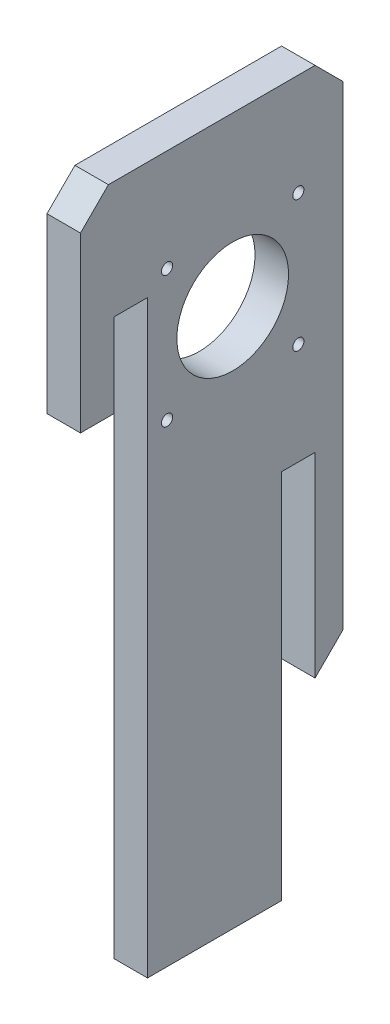
ISO-10303-21;
HEADER;
FILE_DESCRIPTION(('STEP AP214'),'2;1');
FILE_NAME('part.step','',(''),(''),'','','');
FILE_SCHEMA(('AUTOMOTIVE_DESIGN { 1 0 10303 214 1 1 1 1 }'));
ENDSEC;
DATA;
#1=APPLICATION_CONTEXT('core data for automotive mechanical design processes');
#2=APPLICATION_PROTOCOL_DEFINITION('international standard','automotive_design',2000,#1);
#3=PRODUCT_CONTEXT('',#1,'mechanical');
#4=PRODUCT('Part','Part','',(#3));
#5=PRODUCT_RELATED_PRODUCT_CATEGORY('part','',(#4));
#6=PRODUCT_DEFINITION_FORMATION('','',#4);
#7=PRODUCT_DEFINITION_CONTEXT('part definition',#1,'design');
#8=PRODUCT_DEFINITION('design','',#6,#7);
#9=PRODUCT_DEFINITION_SHAPE('','',#8);
#10=(LENGTH_UNIT() NAMED_UNIT(*) SI_UNIT(.MILLI.,.METRE.));
#11=(NAMED_UNIT(*) PLANE_ANGLE_UNIT() SI_UNIT($,.RADIAN.));
#12=(NAMED_UNIT(*) SI_UNIT($,.STERADIAN.) SOLID_ANGLE_UNIT());
#13=UNCERTAINTY_MEASURE_WITH_UNIT(LENGTH_MEASURE(1.E-05),#10,'distance_accuracy_value','');
#14=(GEOMETRIC_REPRESENTATION_CONTEXT(3) GLOBAL_UNCERTAINTY_ASSIGNED_CONTEXT((#13)) GLOBAL_UNIT_ASSIGNED_CONTEXT((#10,
#11,#12)) REPRESENTATION_CONTEXT('',''));
#15=CARTESIAN_POINT('',(0.,0.,0.));
#16=DIRECTION('',(0.,0.,1.));
#17=DIRECTION('',(1.,0.,0.));
#18=AXIS2_PLACEMENT_3D('',#15,#16,#17);
#19=CARTESIAN_POINT('',(0.,-60.,-29.5));
#20=DIRECTION('',(1.,0.,0.));
#21=DIRECTION('',(0.,0.,-1.));
#22=AXIS2_PLACEMENT_3D('',#19,#20,#21);
#23=PLANE('',#22);
#24=CARTESIAN_POINT('',(0.,45.,0.));
#25=DIRECTION('',(-1.,0.,0.));
#26=DIRECTION('',(0.,0.,1.));
#27=AXIS2_PLACEMENT_3D('',#24,#25,#26);
#28=CIRCLE('',#27,6.);
#29=CARTESIAN_POINT('',(0.,45.,6.));
#30=VERTEX_POINT('',#29);
#31=EDGE_CURVE('E255',#30,#30,#28,.T.);
#32=ORIENTED_EDGE('',*,*,#31,.F.);
#33=EDGE_LOOP('',(#32));
#34=FACE_BOUND('',#33,.T.);
#35=CARTESIAN_POINT('',(0.,-45.,0.));
#36=DIRECTION('',(-1.,0.,0.));
#37=DIRECTION('',(0.,0.,1.));
#38=AXIS2_PLACEMENT_3D('',#35,#36,#37);
#39=CIRCLE('',#38,6.);
#40=CARTESIAN_POINT('',(0.,-45.,6.));
#41=VERTEX_POINT('',#40);
#42=EDGE_CURVE('E249',#41,#41,#39,.T.);
#43=ORIENTED_EDGE('',*,*,#42,.F.);
#44=EDGE_LOOP('',(#43));
#45=FACE_BOUND('',#44,.T.);
#46=CARTESIAN_POINT('',(0.,23.5,-23.5));
#47=DIRECTION('',(-1.,0.,0.));
#48=DIRECTION('',(0.,0.,1.));
#49=AXIS2_PLACEMENT_3D('',#46,#47,#48);
#50=CIRCLE('',#49,1.99999999999999);
#51=CARTESIAN_POINT('',(0.,23.5,-21.5));
#52=VERTEX_POINT('',#51);
#53=EDGE_CURVE('E243',#52,#52,#50,.T.);
#54=ORIENTED_EDGE('',*,*,#53,.F.);
#55=EDGE_LOOP('',(#54));
#56=FACE_BOUND('',#55,.T.);
#57=CARTESIAN_POINT('',(0.,23.5,23.5));
#58=DIRECTION('',(-1.,0.,0.));
#59=DIRECTION('',(0.,0.,1.));
#60=AXIS2_PLACEMENT_3D('',#57,#58,#59);
#61=CIRCLE('',#60,1.99999999999999);
#62=CARTESIAN_POINT('',(0.,23.5,25.5));
#63=VERTEX_POINT('',#62);
#64=EDGE_CURVE('E237',#63,#63,#61,.T.);
#65=ORIENTED_EDGE('',*,*,#64,.F.);
#66=EDGE_LOOP('',(#65));
#67=FACE_BOUND('',#66,.T.);
#68=CARTESIAN_POINT('',(0.,-23.5,23.5));
#69=DIRECTION('',(-1.,0.,0.));
#70=DIRECTION('',(0.,0.,1.));
#71=AXIS2_PLACEMENT_3D('',#68,#69,#70);
#72=CIRCLE('',#71,1.99999999999999);
#73=CARTESIAN_POINT('',(0.,-23.5,25.5));
#74=VERTEX_POINT('',#73);
#75=EDGE_CURVE('E231',#74,#74,#72,.T.);
#76=ORIENTED_EDGE('',*,*,#75,.F.);
#77=EDGE_LOOP('',(#76));
#78=FACE_BOUND('',#77,.T.);
#79=CARTESIAN_POINT('',(0.,0.,0.));
#80=DIRECTION('',(1.,0.,0.));
#81=DIRECTION('',(0.,0.,-1.));
#82=AXIS2_PLACEMENT_3D('',#79,#80,#81);
#83=CIRCLE('',#82,20.);
#84=CARTESIAN_POINT('',(0.,0.,-20.));
#85=VERTEX_POINT('',#84);
#86=EDGE_CURVE('E216',#85,#85,#83,.T.);
#87=ORIENTED_EDGE('',*,*,#86,.T.);
#88=EDGE_LOOP('',(#87));
#89=FACE_BOUND('',#88,.T.);
#90=DIRECTION('',(0.,1.,0.));
#91=VECTOR('',#90,1.);
#92=CARTESIAN_POINT('',(0.,60.,-39.5));
#93=LINE('',#92,#91);
#94=CARTESIAN_POINT('',(0.,-120.,-39.5));
#95=VERTEX_POINT('',#94);
#96=CARTESIAN_POINT('',(0.,50.,-39.5));
#97=VERTEX_POINT('',#96);
#98=EDGE_CURVE('E139',#95,#97,#93,.T.);
#99=ORIENTED_EDGE('',*,*,#98,.F.);
#100=DIRECTION('',(0.,0.707106781186549,-0.707106781186546));
#101=VECTOR('',#100,1.);
#102=CARTESIAN_POINT('',(0.,-130.,-29.5000000000001));
#103=LINE('',#102,#101);
#104=CARTESIAN_POINT('',(0.,-130.,-29.5));
#105=VERTEX_POINT('',#104);
#106=EDGE_CURVE('E11',#95,#105,#103,.F.);
#107=ORIENTED_EDGE('',*,*,#106,.T.);
#108=DIRECTION('',(0.,-1.,0.));
#109=VECTOR('',#108,1.);
#110=CARTESIAN_POINT('',(0.,60.,-29.5));
#111=LINE('',#110,#109);
#112=CARTESIAN_POINT('',(0.,-60.,-29.5));
#113=VERTEX_POINT('',#112);
#114=EDGE_CURVE('E137',#113,#105,#111,.T.);
#115=ORIENTED_EDGE('',*,*,#114,.F.);
#116=DIRECTION('',(0.,0.,-1.));
#117=VECTOR('',#116,1.);
#118=CARTESIAN_POINT('',(0.,-60.,29.5));
#119=LINE('',#118,#117);
#120=CARTESIAN_POINT('',(0.,-60.,-17.5));
#121=VERTEX_POINT('',#120);
#122=EDGE_CURVE('E202',#121,#113,#119,.T.);
#123=ORIENTED_EDGE('',*,*,#122,.F.);
#124=DIRECTION('',(0.,-1.,0.));
#125=VECTOR('',#124,1.);
#126=CARTESIAN_POINT('',(0.,-60.,-17.5));
#127=LINE('',#126,#125);
#128=CARTESIAN_POINT('',(0.,-193.,-17.5));
#129=VERTEX_POINT('',#128);
#130=EDGE_CURVE('E152',#121,#129,#127,.T.);
#131=ORIENTED_EDGE('',*,*,#130,.T.);
#132=DIRECTION('',(0.,0.,1.));
#133=VECTOR('',#132,1.);
#134=CARTESIAN_POINT('',(0.,-193.,30.5));
#135=LINE('',#134,#133);
#136=CARTESIAN_POINT('',(0.,-193.,30.5));
#137=VERTEX_POINT('',#136);
#138=EDGE_CURVE('E155',#129,#137,#135,.T.);
#139=ORIENTED_EDGE('',*,*,#138,.T.);
#140=DIRECTION('',(0.,1.,0.));
#141=VECTOR('',#140,1.);
#142=CARTESIAN_POINT('',(0.,-60.,30.5));
#143=LINE('',#142,#141);
#144=CARTESIAN_POINT('',(0.,18.,30.5));
#145=VERTEX_POINT('',#144);
#146=EDGE_CURVE('E176',#137,#145,#143,.T.);
#147=ORIENTED_EDGE('',*,*,#146,.T.);
#148=DIRECTION('',(0.,0.,1.));
#149=VECTOR('',#148,1.);
#150=CARTESIAN_POINT('',(0.,18.,30.5));
#151=LINE('',#150,#149);
#152=CARTESIAN_POINT('',(0.,18.,42.5));
#153=VERTEX_POINT('',#152);
#154=EDGE_CURVE('E276',#145,#153,#151,.T.);
#155=ORIENTED_EDGE('',*,*,#154,.T.);
#156=DIRECTION('',(0.,-1.,0.));
#157=VECTOR('',#156,1.);
#158=CARTESIAN_POINT('',(0.,18.,42.5));
#159=LINE('',#158,#157);
#160=CARTESIAN_POINT('',(0.,-12.,42.5));
#161=VERTEX_POINT('',#160);
#162=EDGE_CURVE('E273',#153,#161,#159,.T.);
#163=ORIENTED_EDGE('',*,*,#162,.T.);
#164=DIRECTION('',(0.,0.,1.));
#165=VECTOR('',#164,1.);
#166=CARTESIAN_POINT('',(0.,-12.,42.5));
#167=LINE('',#166,#165);
#168=CARTESIAN_POINT('',(0.,-12.,54.5));
#169=VERTEX_POINT('',#168);
#170=EDGE_CURVE('E270',#161,#169,#167,.T.);
#171=ORIENTED_EDGE('',*,*,#170,.T.);
#172=DIRECTION('',(0.,1.,0.));
#173=VECTOR('',#172,1.);
#174=CARTESIAN_POINT('',(0.,-12.,54.5));
#175=LINE('',#174,#173);
#176=CARTESIAN_POINT('',(0.,50.,54.5));
#177=VERTEX_POINT('',#176);
#178=EDGE_CURVE('E267',#169,#177,#175,.T.);
#179=ORIENTED_EDGE('',*,*,#178,.T.);
#180=DIRECTION('',(0.,0.707106781186547,-0.707106781186549));
#181=VECTOR('',#180,1.);
#182=CARTESIAN_POINT('',(0.,50.,54.5));
#183=LINE('',#182,#181);
#184=CARTESIAN_POINT('',(0.,60.,44.4999999999999));
#185=VERTEX_POINT('',#184);
#186=EDGE_CURVE('E409',#177,#185,#183,.T.);
#187=ORIENTED_EDGE('',*,*,#186,.T.);
#188=DIRECTION('',(0.,0.,1.));
#189=VECTOR('',#188,1.);
#190=CARTESIAN_POINT('',(0.,60.,29.5));
#191=LINE('',#190,#189);
#192=CARTESIAN_POINT('',(0.,60.,-29.4999999999999));
#193=VERTEX_POINT('',#192);
#194=EDGE_CURVE('E205',#193,#185,#191,.T.);
#195=ORIENTED_EDGE('',*,*,#194,.F.);
#196=DIRECTION('',(0.,-0.707106781186546,-0.707106781186549));
#197=VECTOR('',#196,1.);
#198=CARTESIAN_POINT('',(0.,50.,-39.5));
#199=LINE('',#198,#197);
#200=EDGE_CURVE('E407',#193,#97,#199,.T.);
#201=ORIENTED_EDGE('',*,*,#200,.T.);
#202=EDGE_LOOP('',(#99,#107,#115,#123,#131,#139,#147,#155,#163,#171,#179,#187,#195,#201));
#203=FACE_BOUND('',#202,.T.);
#204=CARTESIAN_POINT('',(0.,-23.5,-23.5));
#205=DIRECTION('',(-1.,0.,0.));
#206=DIRECTION('',(0.,0.,1.));
#207=AXIS2_PLACEMENT_3D('',#204,#205,#206);
#208=CIRCLE('',#207,1.99999999999999);
#209=CARTESIAN_POINT('',(0.,-23.5,-21.5));
#210=VERTEX_POINT('',#209);
#211=EDGE_CURVE('E225',#210,#210,#208,.T.);
#212=ORIENTED_EDGE('',*,*,#211,.F.);
#213=EDGE_LOOP('',(#212));
#214=FACE_BOUND('',#213,.T.);
#215=ADVANCED_FACE('F35',(#34,#45,#56,#67,#78,#89,#203,#214),#23,.F.);
#216=CARTESIAN_POINT('',(12.,-60.,-29.5));
#217=DIRECTION('',(1.,0.,0.));
#218=DIRECTION('',(0.,0.,-1.));
#219=AXIS2_PLACEMENT_3D('',#216,#217,#218);
#220=PLANE('',#219);
#221=CARTESIAN_POINT('',(12.,23.5,-23.5));
#222=DIRECTION('',(1.,0.,0.));
#223=DIRECTION('',(0.,0.,-1.));
#224=AXIS2_PLACEMENT_3D('',#221,#222,#223);
#225=CIRCLE('',#224,1.99999999999999);
#226=CARTESIAN_POINT('',(12.,23.5,-25.5));
#227=VERTEX_POINT('',#226);
#228=EDGE_CURVE('E240',#227,#227,#225,.T.);
#229=ORIENTED_EDGE('',*,*,#228,.F.);
#230=EDGE_LOOP('',(#229));
#231=FACE_BOUND('',#230,.T.);
#232=CARTESIAN_POINT('',(12.,23.5,23.5));
#233=DIRECTION('',(1.,0.,0.));
#234=DIRECTION('',(0.,0.,-1.));
#235=AXIS2_PLACEMENT_3D('',#232,#233,#234);
#236=CIRCLE('',#235,1.99999999999999);
#237=CARTESIAN_POINT('',(12.,23.5,21.5));
#238=VERTEX_POINT('',#237);
#239=EDGE_CURVE('E234',#238,#238,#236,.T.);
#240=ORIENTED_EDGE('',*,*,#239,.F.);
#241=EDGE_LOOP('',(#240));
#242=FACE_BOUND('',#241,.T.);
#243=CARTESIAN_POINT('',(12.,-23.5,23.5));
#244=DIRECTION('',(1.,0.,0.));
#245=DIRECTION('',(0.,0.,-1.));
#246=AXIS2_PLACEMENT_3D('',#243,#244,#245);
#247=CIRCLE('',#246,1.99999999999999);
#248=CARTESIAN_POINT('',(12.,-23.5,21.5));
#249=VERTEX_POINT('',#248);
#250=EDGE_CURVE('E228',#249,#249,#247,.T.);
#251=ORIENTED_EDGE('',*,*,#250,.F.);
#252=EDGE_LOOP('',(#251));
#253=FACE_BOUND('',#252,.T.);
#254=CARTESIAN_POINT('',(12.,-23.5,-23.5));
#255=DIRECTION('',(1.,0.,0.));
#256=DIRECTION('',(0.,0.,-1.));
#257=AXIS2_PLACEMENT_3D('',#254,#255,#256);
#258=CIRCLE('',#257,1.99999999999999);
#259=CARTESIAN_POINT('',(12.,-23.5,-25.5));
#260=VERTEX_POINT('',#259);
#261=EDGE_CURVE('E221',#260,#260,#258,.T.);
#262=ORIENTED_EDGE('',*,*,#261,.F.);
#263=EDGE_LOOP('',(#262));
#264=FACE_BOUND('',#263,.T.);
#265=DIRECTION('',(0.,-1.,0.));
#266=VECTOR('',#265,1.);
#267=CARTESIAN_POINT('',(12.,60.,-29.5));
#268=LINE('',#267,#266);
#269=CARTESIAN_POINT('',(12.,-60.,-29.5));
#270=VERTEX_POINT('',#269);
#271=CARTESIAN_POINT('',(12.,-130.,-29.5));
#272=VERTEX_POINT('',#271);
#273=EDGE_CURVE('E161',#270,#272,#268,.T.);
#274=ORIENTED_EDGE('',*,*,#273,.T.);
#275=DIRECTION('',(0.,-0.707106781186549,0.707106781186546));
#276=VECTOR('',#275,1.);
#277=CARTESIAN_POINT('',(12.,-94.9999999999998,-64.5));
#278=LINE('',#277,#276);
#279=CARTESIAN_POINT('',(12.,-120.,-39.5));
#280=VERTEX_POINT('',#279);
#281=EDGE_CURVE('E57',#272,#280,#278,.F.);
#282=ORIENTED_EDGE('',*,*,#281,.T.);
#283=DIRECTION('',(0.,1.,0.));
#284=VECTOR('',#283,1.);
#285=CARTESIAN_POINT('',(12.,60.,-39.5));
#286=LINE('',#285,#284);
#287=CARTESIAN_POINT('',(12.,50.,-39.5));
#288=VERTEX_POINT('',#287);
#289=EDGE_CURVE('E150',#280,#288,#286,.T.);
#290=ORIENTED_EDGE('',*,*,#289,.T.);
#291=DIRECTION('',(0.,0.707106781186546,0.707106781186549));
#292=VECTOR('',#291,1.);
#293=CARTESIAN_POINT('',(12.,1.52655665885959E-13,-89.5));
#294=LINE('',#293,#292);
#295=CARTESIAN_POINT('',(12.,60.,-29.5));
#296=VERTEX_POINT('',#295);
#297=EDGE_CURVE('E415',#288,#296,#294,.T.);
#298=ORIENTED_EDGE('',*,*,#297,.T.);
#299=DIRECTION('',(0.,0.,1.));
#300=VECTOR('',#299,1.);
#301=CARTESIAN_POINT('',(12.,60.,29.5));
#302=LINE('',#301,#300);
#303=CARTESIAN_POINT('',(12.,60.,44.4999999999999));
#304=VERTEX_POINT('',#303);
#305=EDGE_CURVE('E204',#296,#304,#302,.T.);
#306=ORIENTED_EDGE('',*,*,#305,.T.);
#307=DIRECTION('',(0.,-0.707106781186547,0.707106781186549));
#308=VECTOR('',#307,1.);
#309=CARTESIAN_POINT('',(12.,37.0000000000001,67.4999999999999));
#310=LINE('',#309,#308);
#311=CARTESIAN_POINT('',(12.,49.9999999999999,54.5));
#312=VERTEX_POINT('',#311);
#313=EDGE_CURVE('E416',#304,#312,#310,.T.);
#314=ORIENTED_EDGE('',*,*,#313,.T.);
#315=DIRECTION('',(0.,1.,0.));
#316=VECTOR('',#315,1.);
#317=CARTESIAN_POINT('',(12.,-12.,54.5));
#318=LINE('',#317,#316);
#319=CARTESIAN_POINT('',(12.,-12.,54.5));
#320=VERTEX_POINT('',#319);
#321=EDGE_CURVE('E262',#320,#312,#318,.T.);
#322=ORIENTED_EDGE('',*,*,#321,.F.);
#323=DIRECTION('',(0.,0.,1.));
#324=VECTOR('',#323,1.);
#325=CARTESIAN_POINT('',(12.,-12.,42.5));
#326=LINE('',#325,#324);
#327=CARTESIAN_POINT('',(12.,-12.,42.5));
#328=VERTEX_POINT('',#327);
#329=EDGE_CURVE('E283',#328,#320,#326,.T.);
#330=ORIENTED_EDGE('',*,*,#329,.F.);
#331=DIRECTION('',(0.,-1.,0.));
#332=VECTOR('',#331,1.);
#333=CARTESIAN_POINT('',(12.,18.,42.5));
#334=LINE('',#333,#332);
#335=CARTESIAN_POINT('',(12.,18.,42.5));
#336=VERTEX_POINT('',#335);
#337=EDGE_CURVE('E286',#336,#328,#334,.T.);
#338=ORIENTED_EDGE('',*,*,#337,.F.);
#339=DIRECTION('',(0.,0.,1.));
#340=VECTOR('',#339,1.);
#341=CARTESIAN_POINT('',(12.,18.,30.5));
#342=LINE('',#341,#340);
#343=CARTESIAN_POINT('',(12.,18.,30.5));
#344=VERTEX_POINT('',#343);
#345=EDGE_CURVE('E288',#344,#336,#342,.T.);
#346=ORIENTED_EDGE('',*,*,#345,.F.);
#347=DIRECTION('',(0.,1.,0.));
#348=VECTOR('',#347,1.);
#349=CARTESIAN_POINT('',(12.,-60.,30.5));
#350=LINE('',#349,#348);
#351=CARTESIAN_POINT('',(12.,-193.,30.5));
#352=VERTEX_POINT('',#351);
#353=EDGE_CURVE('E181',#352,#344,#350,.T.);
#354=ORIENTED_EDGE('',*,*,#353,.F.);
#355=DIRECTION('',(0.,0.,1.));
#356=VECTOR('',#355,1.);
#357=CARTESIAN_POINT('',(12.,-193.,30.5));
#358=LINE('',#357,#356);
#359=CARTESIAN_POINT('',(12.,-193.,-17.5));
#360=VERTEX_POINT('',#359);
#361=EDGE_CURVE('E166',#360,#352,#358,.T.);
#362=ORIENTED_EDGE('',*,*,#361,.F.);
#363=DIRECTION('',(0.,-1.,0.));
#364=VECTOR('',#363,1.);
#365=CARTESIAN_POINT('',(12.,-60.,-17.5));
#366=LINE('',#365,#364);
#367=CARTESIAN_POINT('',(12.,-60.,-17.5));
#368=VERTEX_POINT('',#367);
#369=EDGE_CURVE('E170',#368,#360,#366,.T.);
#370=ORIENTED_EDGE('',*,*,#369,.F.);
#371=DIRECTION('',(0.,0.,-1.));
#372=VECTOR('',#371,1.);
#373=CARTESIAN_POINT('',(12.,-60.,29.5));
#374=LINE('',#373,#372);
#375=EDGE_CURVE('E195',#368,#270,#374,.T.);
#376=ORIENTED_EDGE('',*,*,#375,.T.);
#377=EDGE_LOOP('',(#274,#282,#290,#298,#306,#314,#322,#330,#338,#346,#354,#362,#370,#376));
#378=FACE_BOUND('',#377,.T.);
#379=CARTESIAN_POINT('',(12.,0.,0.));
#380=DIRECTION('',(1.,0.,0.));
#381=DIRECTION('',(0.,0.,-1.));
#382=AXIS2_PLACEMENT_3D('',#379,#380,#381);
#383=CIRCLE('',#382,20.);
#384=CARTESIAN_POINT('',(12.,0.,-20.));
#385=VERTEX_POINT('',#384);
#386=EDGE_CURVE('E211',#385,#385,#383,.T.);
#387=ORIENTED_EDGE('',*,*,#386,.F.);
#388=EDGE_LOOP('',(#387));
#389=FACE_BOUND('',#388,.T.);
#390=ADVANCED_FACE('F298',(#231,#242,#253,#264,#378,#389),#220,.T.);
#391=CARTESIAN_POINT('',(12.,60.,29.5));
#392=DIRECTION('',(0.,-1.,0.));
#393=DIRECTION('',(0.,0.,-1.));
#394=AXIS2_PLACEMENT_3D('',#391,#392,#393);
#395=PLANE('',#394);
#396=ORIENTED_EDGE('',*,*,#305,.F.);
#397=DIRECTION('',(-1.,0.,0.));
#398=VECTOR('',#397,1.);
#399=CARTESIAN_POINT('',(0.,60.,-29.5));
#400=LINE('',#399,#398);
#401=EDGE_CURVE('E411',#296,#193,#400,.T.);
#402=ORIENTED_EDGE('',*,*,#401,.T.);
#403=ORIENTED_EDGE('',*,*,#194,.T.);
#404=DIRECTION('',(1.,0.,0.));
#405=VECTOR('',#404,1.);
#406=CARTESIAN_POINT('',(12.,60.,44.4999999999999));
#407=LINE('',#406,#405);
#408=EDGE_CURVE('E413',#185,#304,#407,.T.);
#409=ORIENTED_EDGE('',*,*,#408,.T.);
#410=EDGE_LOOP('',(#396,#402,#403,#409));
#411=FACE_BOUND('',#410,.T.);
#412=ADVANCED_FACE('F319',(#411),#395,.F.);
#413=CARTESIAN_POINT('',(12.,-60.,29.5));
#414=DIRECTION('',(0.,1.,0.));
#415=DIRECTION('',(0.,0.,1.));
#416=AXIS2_PLACEMENT_3D('',#413,#414,#415);
#417=PLANE('',#416);
#418=ORIENTED_EDGE('',*,*,#375,.F.);
#419=DIRECTION('',(-1.,0.,0.));
#420=VECTOR('',#419,1.);
#421=CARTESIAN_POINT('',(12.,-60.,-17.5));
#422=LINE('',#421,#420);
#423=EDGE_CURVE('E169',#368,#121,#422,.T.);
#424=ORIENTED_EDGE('',*,*,#423,.T.);
#425=ORIENTED_EDGE('',*,*,#122,.T.);
#426=DIRECTION('',(-1.,0.,0.));
#427=VECTOR('',#426,1.);
#428=CARTESIAN_POINT('',(12.,-60.,-29.5));
#429=LINE('',#428,#427);
#430=EDGE_CURVE('E149',#270,#113,#429,.T.);
#431=ORIENTED_EDGE('',*,*,#430,.F.);
#432=EDGE_LOOP('',(#418,#424,#425,#431));
#433=FACE_BOUND('',#432,.T.);
#434=ADVANCED_FACE('F316',(#433),#417,.F.);
#435=CARTESIAN_POINT('',(12.,0.,0.));
#436=DIRECTION('',(-1.,0.,0.));
#437=DIRECTION('',(0.,0.,1.));
#438=AXIS2_PLACEMENT_3D('',#435,#436,#437);
#439=CYLINDRICAL_SURFACE('',#438,20.);
#440=ORIENTED_EDGE('',*,*,#386,.T.);
#441=EDGE_LOOP('',(#440));
#442=FACE_BOUND('',#441,.T.);
#443=ORIENTED_EDGE('',*,*,#86,.F.);
#444=EDGE_LOOP('',(#443));
#445=FACE_BOUND('',#444,.T.);
#446=ADVANCED_FACE('F318',(#442,#445),#439,.F.);
#447=CARTESIAN_POINT('',(0.,-23.5,-23.5));
#448=DIRECTION('',(-1.,0.,0.));
#449=DIRECTION('',(0.,0.,1.));
#450=AXIS2_PLACEMENT_3D('',#447,#448,#449);
#451=CYLINDRICAL_SURFACE('',#450,1.99999999999999);
#452=ORIENTED_EDGE('',*,*,#211,.T.);
#453=EDGE_LOOP('',(#452));
#454=FACE_BOUND('',#453,.T.);
#455=ORIENTED_EDGE('',*,*,#261,.T.);
#456=EDGE_LOOP('',(#455));
#457=FACE_BOUND('',#456,.T.);
#458=ADVANCED_FACE('F325',(#454,#457),#451,.F.);
#459=CARTESIAN_POINT('',(0.,-23.5,23.5));
#460=DIRECTION('',(-1.,0.,0.));
#461=DIRECTION('',(0.,0.,1.));
#462=AXIS2_PLACEMENT_3D('',#459,#460,#461);
#463=CYLINDRICAL_SURFACE('',#462,1.99999999999999);
#464=ORIENTED_EDGE('',*,*,#75,.T.);
#465=EDGE_LOOP('',(#464));
#466=FACE_BOUND('',#465,.T.);
#467=ORIENTED_EDGE('',*,*,#250,.T.);
#468=EDGE_LOOP('',(#467));
#469=FACE_BOUND('',#468,.T.);
#470=ADVANCED_FACE('F341',(#466,#469),#463,.F.);
#471=CARTESIAN_POINT('',(0.,23.5,23.5));
#472=DIRECTION('',(-1.,0.,0.));
#473=DIRECTION('',(0.,0.,1.));
#474=AXIS2_PLACEMENT_3D('',#471,#472,#473);
#475=CYLINDRICAL_SURFACE('',#474,1.99999999999999);
#476=ORIENTED_EDGE('',*,*,#64,.T.);
#477=EDGE_LOOP('',(#476));
#478=FACE_BOUND('',#477,.T.);
#479=ORIENTED_EDGE('',*,*,#239,.T.);
#480=EDGE_LOOP('',(#479));
#481=FACE_BOUND('',#480,.T.);
#482=ADVANCED_FACE('F345',(#478,#481),#475,.F.);
#483=CARTESIAN_POINT('',(0.,23.5,-23.5));
#484=DIRECTION('',(-1.,0.,0.));
#485=DIRECTION('',(0.,0.,1.));
#486=AXIS2_PLACEMENT_3D('',#483,#484,#485);
#487=CYLINDRICAL_SURFACE('',#486,1.99999999999999);
#488=ORIENTED_EDGE('',*,*,#53,.T.);
#489=EDGE_LOOP('',(#488));
#490=FACE_BOUND('',#489,.T.);
#491=ORIENTED_EDGE('',*,*,#228,.T.);
#492=EDGE_LOOP('',(#491));
#493=FACE_BOUND('',#492,.T.);
#494=ADVANCED_FACE('F349',(#490,#493),#487,.F.);
#495=CARTESIAN_POINT('',(6.,-45.,0.));
#496=DIRECTION('',(1.,0.,0.));
#497=DIRECTION('',(0.,0.,-1.));
#498=AXIS2_PLACEMENT_3D('',#495,#496,#497);
#499=PLANE('',#498);
#500=CARTESIAN_POINT('',(6.,-45.,0.));
#501=DIRECTION('',(-1.,0.,0.));
#502=DIRECTION('',(0.,0.,1.));
#503=AXIS2_PLACEMENT_3D('',#500,#501,#502);
#504=CIRCLE('',#503,6.);
#505=CARTESIAN_POINT('',(6.,-45.,6.));
#506=VERTEX_POINT('',#505);
#507=EDGE_CURVE('E246',#506,#506,#504,.T.);
#508=ORIENTED_EDGE('',*,*,#507,.T.);
#509=EDGE_LOOP('',(#508));
#510=FACE_BOUND('',#509,.T.);
#511=ADVANCED_FACE('F353',(#510),#499,.F.);
#512=CARTESIAN_POINT('',(0.,-45.,0.));
#513=DIRECTION('',(-1.,0.,0.));
#514=DIRECTION('',(0.,0.,1.));
#515=AXIS2_PLACEMENT_3D('',#512,#513,#514);
#516=CYLINDRICAL_SURFACE('',#515,6.);
#517=ORIENTED_EDGE('',*,*,#507,.F.);
#518=EDGE_LOOP('',(#517));
#519=FACE_BOUND('',#518,.T.);
#520=ORIENTED_EDGE('',*,*,#42,.T.);
#521=EDGE_LOOP('',(#520));
#522=FACE_BOUND('',#521,.T.);
#523=ADVANCED_FACE('F357',(#519,#522),#516,.F.);
#524=CARTESIAN_POINT('',(6.,45.,0.));
#525=DIRECTION('',(1.,0.,0.));
#526=DIRECTION('',(0.,0.,-1.));
#527=AXIS2_PLACEMENT_3D('',#524,#525,#526);
#528=PLANE('',#527);
#529=CARTESIAN_POINT('',(6.,45.,0.));
#530=DIRECTION('',(-1.,0.,0.));
#531=DIRECTION('',(0.,0.,1.));
#532=AXIS2_PLACEMENT_3D('',#529,#530,#531);
#533=CIRCLE('',#532,6.);
#534=CARTESIAN_POINT('',(6.,45.,6.));
#535=VERTEX_POINT('',#534);
#536=EDGE_CURVE('E252',#535,#535,#533,.T.);
#537=ORIENTED_EDGE('',*,*,#536,.T.);
#538=EDGE_LOOP('',(#537));
#539=FACE_BOUND('',#538,.T.);
#540=ADVANCED_FACE('F361',(#539),#528,.F.);
#541=CARTESIAN_POINT('',(0.,45.,0.));
#542=DIRECTION('',(-1.,0.,0.));
#543=DIRECTION('',(0.,0.,1.));
#544=AXIS2_PLACEMENT_3D('',#541,#542,#543);
#545=CYLINDRICAL_SURFACE('',#544,6.);
#546=ORIENTED_EDGE('',*,*,#536,.F.);
#547=EDGE_LOOP('',(#546));
#548=FACE_BOUND('',#547,.T.);
#549=ORIENTED_EDGE('',*,*,#31,.T.);
#550=EDGE_LOOP('',(#549));
#551=FACE_BOUND('',#550,.T.);
#552=ADVANCED_FACE('F365',(#548,#551),#545,.F.);
#553=CARTESIAN_POINT('',(12.,-12.,54.5));
#554=DIRECTION('',(0.,0.,1.));
#555=DIRECTION('',(1.,0.,0.));
#556=AXIS2_PLACEMENT_3D('',#553,#554,#555);
#557=PLANE('',#556);
#558=ORIENTED_EDGE('',*,*,#321,.T.);
#559=DIRECTION('',(-1.,0.,0.));
#560=VECTOR('',#559,1.);
#561=CARTESIAN_POINT('',(0.,50.,54.5));
#562=LINE('',#561,#560);
#563=EDGE_CURVE('E402',#312,#177,#562,.T.);
#564=ORIENTED_EDGE('',*,*,#563,.T.);
#565=ORIENTED_EDGE('',*,*,#178,.F.);
#566=DIRECTION('',(-1.,0.,0.));
#567=VECTOR('',#566,1.);
#568=CARTESIAN_POINT('',(12.,-12.,54.5));
#569=LINE('',#568,#567);
#570=EDGE_CURVE('E258',#320,#169,#569,.T.);
#571=ORIENTED_EDGE('',*,*,#570,.F.);
#572=EDGE_LOOP('',(#558,#564,#565,#571));
#573=FACE_BOUND('',#572,.T.);
#574=ADVANCED_FACE('F369',(#573),#557,.T.);
#575=CARTESIAN_POINT('',(12.,-12.,42.5));
#576=DIRECTION('',(0.,-1.,0.));
#577=DIRECTION('',(0.,0.,-1.));
#578=AXIS2_PLACEMENT_3D('',#575,#576,#577);
#579=PLANE('',#578);
#580=ORIENTED_EDGE('',*,*,#170,.F.);
#581=DIRECTION('',(-1.,0.,0.));
#582=VECTOR('',#581,1.);
#583=CARTESIAN_POINT('',(12.,-12.,42.5));
#584=LINE('',#583,#582);
#585=EDGE_CURVE('E264',#328,#161,#584,.T.);
#586=ORIENTED_EDGE('',*,*,#585,.F.);
#587=ORIENTED_EDGE('',*,*,#329,.T.);
#588=ORIENTED_EDGE('',*,*,#570,.T.);
#589=EDGE_LOOP('',(#580,#586,#587,#588));
#590=FACE_BOUND('',#589,.T.);
#591=ADVANCED_FACE('F377',(#590),#579,.T.);
#592=CARTESIAN_POINT('',(12.,18.,42.5));
#593=DIRECTION('',(0.,0.,-1.));
#594=DIRECTION('',(0.,1.,0.));
#595=AXIS2_PLACEMENT_3D('',#592,#593,#594);
#596=PLANE('',#595);
#597=ORIENTED_EDGE('',*,*,#162,.F.);
#598=DIRECTION('',(-1.,0.,0.));
#599=VECTOR('',#598,1.);
#600=CARTESIAN_POINT('',(12.,18.,42.5));
#601=LINE('',#600,#599);
#602=EDGE_CURVE('E261',#336,#153,#601,.T.);
#603=ORIENTED_EDGE('',*,*,#602,.F.);
#604=ORIENTED_EDGE('',*,*,#337,.T.);
#605=ORIENTED_EDGE('',*,*,#585,.T.);
#606=EDGE_LOOP('',(#597,#603,#604,#605));
#607=FACE_BOUND('',#606,.T.);
#608=ADVANCED_FACE('F306',(#607),#596,.T.);
#609=CARTESIAN_POINT('',(12.,18.,30.5));
#610=DIRECTION('',(0.,-1.,0.));
#611=DIRECTION('',(0.,0.,-1.));
#612=AXIS2_PLACEMENT_3D('',#609,#610,#611);
#613=PLANE('',#612);
#614=ORIENTED_EDGE('',*,*,#154,.F.);
#615=DIRECTION('',(-1.,0.,0.));
#616=VECTOR('',#615,1.);
#617=CARTESIAN_POINT('',(12.,18.,30.5));
#618=LINE('',#617,#616);
#619=EDGE_CURVE('E259',#344,#145,#618,.T.);
#620=ORIENTED_EDGE('',*,*,#619,.F.);
#621=ORIENTED_EDGE('',*,*,#345,.T.);
#622=ORIENTED_EDGE('',*,*,#602,.T.);
#623=EDGE_LOOP('',(#614,#620,#621,#622));
#624=FACE_BOUND('',#623,.T.);
#625=ADVANCED_FACE('F308',(#624),#613,.T.);
#626=CARTESIAN_POINT('',(12.,-60.,30.5));
#627=DIRECTION('',(0.,0.,1.));
#628=DIRECTION('',(0.,-1.,0.));
#629=AXIS2_PLACEMENT_3D('',#626,#627,#628);
#630=PLANE('',#629);
#631=ORIENTED_EDGE('',*,*,#146,.F.);
#632=DIRECTION('',(-1.,0.,0.));
#633=VECTOR('',#632,1.);
#634=CARTESIAN_POINT('',(12.,-193.,30.5));
#635=LINE('',#634,#633);
#636=EDGE_CURVE('E173',#352,#137,#635,.T.);
#637=ORIENTED_EDGE('',*,*,#636,.F.);
#638=ORIENTED_EDGE('',*,*,#353,.T.);
#639=ORIENTED_EDGE('',*,*,#619,.T.);
#640=EDGE_LOOP('',(#631,#637,#638,#639));
#641=FACE_BOUND('',#640,.T.);
#642=ADVANCED_FACE('F295',(#641),#630,.T.);
#643=CARTESIAN_POINT('',(12.,-193.,30.5));
#644=DIRECTION('',(0.,-1.,0.));
#645=DIRECTION('',(0.,0.,-1.));
#646=AXIS2_PLACEMENT_3D('',#643,#644,#645);
#647=PLANE('',#646);
#648=ORIENTED_EDGE('',*,*,#138,.F.);
#649=DIRECTION('',(-1.,0.,0.));
#650=VECTOR('',#649,1.);
#651=CARTESIAN_POINT('',(12.,-193.,-17.5));
#652=LINE('',#651,#650);
#653=EDGE_CURVE('E177',#360,#129,#652,.T.);
#654=ORIENTED_EDGE('',*,*,#653,.F.);
#655=ORIENTED_EDGE('',*,*,#361,.T.);
#656=ORIENTED_EDGE('',*,*,#636,.T.);
#657=EDGE_LOOP('',(#648,#654,#655,#656));
#658=FACE_BOUND('',#657,.T.);
#659=ADVANCED_FACE('F311',(#658),#647,.T.);
#660=CARTESIAN_POINT('',(12.,-60.,-17.5));
#661=DIRECTION('',(0.,0.,-1.));
#662=DIRECTION('',(0.,1.,0.));
#663=AXIS2_PLACEMENT_3D('',#660,#661,#662);
#664=PLANE('',#663);
#665=ORIENTED_EDGE('',*,*,#130,.F.);
#666=ORIENTED_EDGE('',*,*,#423,.F.);
#667=ORIENTED_EDGE('',*,*,#369,.T.);
#668=ORIENTED_EDGE('',*,*,#653,.T.);
#669=EDGE_LOOP('',(#665,#666,#667,#668));
#670=FACE_BOUND('',#669,.T.);
#671=ADVANCED_FACE('F313',(#670),#664,.T.);
#672=CARTESIAN_POINT('',(0.,60.,-29.5));
#673=DIRECTION('',(0.,0.,1.));
#674=DIRECTION('',(0.,-1.,0.));
#675=AXIS2_PLACEMENT_3D('',#672,#673,#674);
#676=PLANE('',#675);
#677=ORIENTED_EDGE('',*,*,#273,.F.);
#678=ORIENTED_EDGE('',*,*,#430,.T.);
#679=ORIENTED_EDGE('',*,*,#114,.T.);
#680=DIRECTION('',(1.,0.,0.));
#681=VECTOR('',#680,1.);
#682=CARTESIAN_POINT('',(0.,-130.,-29.5));
#683=LINE('',#682,#681);
#684=EDGE_CURVE('E147',#105,#272,#683,.T.);
#685=ORIENTED_EDGE('',*,*,#684,.T.);
#686=EDGE_LOOP('',(#677,#678,#679,#685));
#687=FACE_BOUND('',#686,.T.);
#688=ADVANCED_FACE('F146',(#687),#676,.T.);
#689=CARTESIAN_POINT('',(0.,60.,-39.5));
#690=DIRECTION('',(0.,0.,-1.));
#691=DIRECTION('',(0.,1.,0.));
#692=AXIS2_PLACEMENT_3D('',#689,#690,#691);
#693=PLANE('',#692);
#694=ORIENTED_EDGE('',*,*,#289,.F.);
#695=DIRECTION('',(-1.,0.,0.));
#696=VECTOR('',#695,1.);
#697=CARTESIAN_POINT('',(0.,-120.,-39.5));
#698=LINE('',#697,#696);
#699=EDGE_CURVE('E43',#280,#95,#698,.T.);
#700=ORIENTED_EDGE('',*,*,#699,.T.);
#701=ORIENTED_EDGE('',*,*,#98,.T.);
#702=DIRECTION('',(1.,0.,0.));
#703=VECTOR('',#702,1.);
#704=CARTESIAN_POINT('',(12.,50.,-39.5));
#705=LINE('',#704,#703);
#706=EDGE_CURVE('E194',#97,#288,#705,.T.);
#707=ORIENTED_EDGE('',*,*,#706,.T.);
#708=EDGE_LOOP('',(#694,#700,#701,#707));
#709=FACE_BOUND('',#708,.T.);
#710=ADVANCED_FACE('F390',(#709),#693,.T.);
#711=CARTESIAN_POINT('',(0.,50.,-39.5));
#712=DIRECTION('',(0.,0.707106781186549,-0.707106781186546));
#713=DIRECTION('',(0.,0.707106781186546,0.707106781186549));
#714=AXIS2_PLACEMENT_3D('',#711,#712,#713);
#715=PLANE('',#714);
#716=ORIENTED_EDGE('',*,*,#200,.F.);
#717=ORIENTED_EDGE('',*,*,#401,.F.);
#718=ORIENTED_EDGE('',*,*,#297,.F.);
#719=ORIENTED_EDGE('',*,*,#706,.F.);
#720=EDGE_LOOP('',(#716,#717,#718,#719));
#721=FACE_BOUND('',#720,.T.);
#722=ADVANCED_FACE('F392',(#721),#715,.T.);
#723=CARTESIAN_POINT('',(12.,50.,54.5));
#724=DIRECTION('',(0.,0.707106781186548,0.707106781186546));
#725=DIRECTION('',(0.,-0.707106781186547,0.707106781186549));
#726=AXIS2_PLACEMENT_3D('',#723,#724,#725);
#727=PLANE('',#726);
#728=ORIENTED_EDGE('',*,*,#313,.F.);
#729=ORIENTED_EDGE('',*,*,#408,.F.);
#730=ORIENTED_EDGE('',*,*,#186,.F.);
#731=ORIENTED_EDGE('',*,*,#563,.F.);
#732=EDGE_LOOP('',(#728,#729,#730,#731));
#733=FACE_BOUND('',#732,.T.);
#734=ADVANCED_FACE('F396',(#733),#727,.T.);
#735=CARTESIAN_POINT('',(0.,-130.,-29.5000000000001));
#736=DIRECTION('',(0.,0.707106781186546,0.707106781186549));
#737=DIRECTION('',(0.,-0.707106781186549,0.707106781186546));
#738=AXIS2_PLACEMENT_3D('',#735,#736,#737);
#739=PLANE('',#738);
#740=ORIENTED_EDGE('',*,*,#106,.F.);
#741=ORIENTED_EDGE('',*,*,#699,.F.);
#742=ORIENTED_EDGE('',*,*,#281,.F.);
#743=ORIENTED_EDGE('',*,*,#684,.F.);
#744=EDGE_LOOP('',(#740,#741,#742,#743));
#745=FACE_BOUND('',#744,.T.);
#746=ADVANCED_FACE('F37',(#745),#739,.F.);
#747=CLOSED_SHELL('',(#215,#390,#412,#434,#446,#458,#470,#482,#494,#511,#523,#540,#552,#574,
#591,#608,#625,#642,#659,#671,#688,#710,#722,#734,#746));
#748=MANIFOLD_SOLID_BREP('B2',#747);
#749=ADVANCED_BREP_SHAPE_REPRESENTATION('',(#18,#748),#14);
#750=SHAPE_DEFINITION_REPRESENTATION(#9,#749);
ENDSEC;
END-ISO-10303-21;
